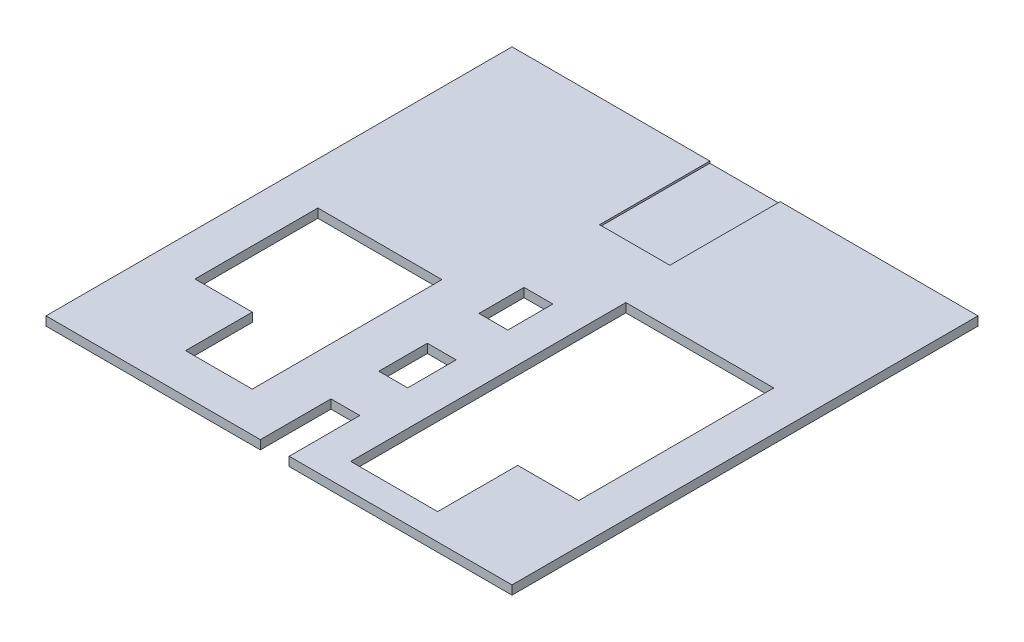
ISO-10303-21;
HEADER;
FILE_DESCRIPTION(('STEP AP214'),'2;1');
FILE_NAME('part.step','',(''),(''),'','','');
FILE_SCHEMA(('AUTOMOTIVE_DESIGN { 1 0 10303 214 1 1 1 1 }'));
ENDSEC;
DATA;
#1=APPLICATION_CONTEXT('core data for automotive mechanical design processes');
#2=APPLICATION_PROTOCOL_DEFINITION('international standard','automotive_design',2000,#1);
#3=PRODUCT_CONTEXT('',#1,'mechanical');
#4=PRODUCT('Part','Part','',(#3));
#5=PRODUCT_RELATED_PRODUCT_CATEGORY('part','',(#4));
#6=PRODUCT_DEFINITION_FORMATION('','',#4);
#7=PRODUCT_DEFINITION_CONTEXT('part definition',#1,'design');
#8=PRODUCT_DEFINITION('design','',#6,#7);
#9=PRODUCT_DEFINITION_SHAPE('','',#8);
#10=(LENGTH_UNIT() NAMED_UNIT(*) SI_UNIT(.MILLI.,.METRE.));
#11=(NAMED_UNIT(*) PLANE_ANGLE_UNIT() SI_UNIT($,.RADIAN.));
#12=(NAMED_UNIT(*) SI_UNIT($,.STERADIAN.) SOLID_ANGLE_UNIT());
#13=UNCERTAINTY_MEASURE_WITH_UNIT(LENGTH_MEASURE(1.E-05),#10,'distance_accuracy_value','');
#14=(GEOMETRIC_REPRESENTATION_CONTEXT(3) GLOBAL_UNCERTAINTY_ASSIGNED_CONTEXT((#13)) GLOBAL_UNIT_ASSIGNED_CONTEXT((#10,
#11,#12)) REPRESENTATION_CONTEXT('',''));
#15=CARTESIAN_POINT('',(0.,0.,0.));
#16=DIRECTION('',(0.,0.,1.));
#17=DIRECTION('',(1.,0.,0.));
#18=AXIS2_PLACEMENT_3D('',#15,#16,#17);
#19=CARTESIAN_POINT('',(0.,2.3,0.));
#20=DIRECTION('',(0.,-1.,0.));
#21=DIRECTION('',(0.,0.,-1.));
#22=AXIS2_PLACEMENT_3D('',#19,#20,#21);
#23=PLANE('',#22);
#24=DIRECTION('',(0.,0.,-1.));
#25=VECTOR('',#24,1.);
#26=CARTESIAN_POINT('',(25.7198970679973,2.3,0.));
#27=LINE('',#26,#25);
#28=CARTESIAN_POINT('',(25.7198970679973,2.3,-10.2105821290763));
#29=VERTEX_POINT('',#28);
#30=CARTESIAN_POINT('',(25.7198970679973,2.3,-27.3967942055364));
#31=VERTEX_POINT('',#30);
#32=EDGE_CURVE('E414',#29,#31,#27,.T.);
#33=ORIENTED_EDGE('',*,*,#32,.T.);
#34=DIRECTION('',(1.,0.,0.));
#35=VECTOR('',#34,1.);
#36=CARTESIAN_POINT('',(0.,2.3,-27.3967942055364));
#37=LINE('',#36,#35);
#38=CARTESIAN_POINT('',(10.9506312686845,2.3,-27.3967942055364));
#39=VERTEX_POINT('',#38);
#40=EDGE_CURVE('E429',#39,#31,#37,.T.);
#41=ORIENTED_EDGE('',*,*,#40,.F.);
#42=DIRECTION('',(0.,0.,1.));
#43=VECTOR('',#42,1.);
#44=CARTESIAN_POINT('',(10.9506312686845,2.3,0.));
#45=LINE('',#44,#43);
#46=CARTESIAN_POINT('',(10.9506312686845,2.3,-59.0583566195129));
#47=VERTEX_POINT('',#46);
#48=EDGE_CURVE('E426',#47,#39,#45,.T.);
#49=ORIENTED_EDGE('',*,*,#48,.F.);
#50=DIRECTION('',(1.,0.,0.));
#51=VECTOR('',#50,1.);
#52=CARTESIAN_POINT('',(0.,2.3,-59.0583566195129));
#53=LINE('',#52,#51);
#54=CARTESIAN_POINT('',(42.8973244163302,2.3,-59.0583566195129));
#55=VERTEX_POINT('',#54);
#56=EDGE_CURVE('E423',#47,#55,#53,.T.);
#57=ORIENTED_EDGE('',*,*,#56,.T.);
#58=DIRECTION('',(0.,0.,1.));
#59=VECTOR('',#58,1.);
#60=CARTESIAN_POINT('',(42.8973244163302,2.3,0.));
#61=LINE('',#60,#59);
#62=CARTESIAN_POINT('',(42.8973244163302,2.3,-10.2105821290763));
#63=VERTEX_POINT('',#62);
#64=EDGE_CURVE('E420',#55,#63,#61,.T.);
#65=ORIENTED_EDGE('',*,*,#64,.T.);
#66=DIRECTION('',(1.,0.,0.));
#67=VECTOR('',#66,1.);
#68=CARTESIAN_POINT('',(0.,2.3,-10.2105821290763));
#69=LINE('',#68,#67);
#70=EDGE_CURVE('E417',#29,#63,#69,.T.);
#71=ORIENTED_EDGE('',*,*,#70,.F.);
#72=EDGE_LOOP('',(#33,#41,#49,#57,#65,#71));
#73=FACE_BOUND('',#72,.T.);
#74=DIRECTION('',(0.,0.,-1.));
#75=VECTOR('',#74,1.);
#76=CARTESIAN_POINT('',(62.6240548528614,2.3,0.));
#77=LINE('',#76,#75);
#78=CARTESIAN_POINT('',(62.6240548528614,2.3,-30.4982257973734));
#79=VERTEX_POINT('',#78);
#80=CARTESIAN_POINT('',(62.6240548528614,2.3,-42.9965652808733));
#81=VERTEX_POINT('',#80);
#82=EDGE_CURVE('E355',#79,#81,#77,.T.);
#83=ORIENTED_EDGE('',*,*,#82,.F.);
#84=DIRECTION('',(1.,0.,0.));
#85=VECTOR('',#84,1.);
#86=CARTESIAN_POINT('',(0.,2.3,-30.4982257973734));
#87=LINE('',#86,#85);
#88=CARTESIAN_POINT('',(55.2019322189707,2.3,-30.4982257973734));
#89=VERTEX_POINT('',#88);
#90=EDGE_CURVE('E353',#89,#79,#87,.T.);
#91=ORIENTED_EDGE('',*,*,#90,.F.);
#92=DIRECTION('',(0.,0.,-1.));
#93=VECTOR('',#92,1.);
#94=CARTESIAN_POINT('',(55.2019322189707,2.3,0.));
#95=LINE('',#94,#93);
#96=CARTESIAN_POINT('',(55.2019322189707,2.3,-42.9965652808733));
#97=VERTEX_POINT('',#96);
#98=EDGE_CURVE('E361',#89,#97,#95,.T.);
#99=ORIENTED_EDGE('',*,*,#98,.T.);
#100=DIRECTION('',(1.,0.,0.));
#101=VECTOR('',#100,1.);
#102=CARTESIAN_POINT('',(0.,2.3,-42.9965652808733));
#103=LINE('',#102,#101);
#104=EDGE_CURVE('E358',#97,#81,#103,.T.);
#105=ORIENTED_EDGE('',*,*,#104,.T.);
#106=EDGE_LOOP('',(#83,#91,#99,#105));
#107=FACE_BOUND('',#106,.T.);
#108=DIRECTION('',(0.,0.,-1.));
#109=VECTOR('',#108,1.);
#110=CARTESIAN_POINT('',(62.6240548528614,2.3,0.));
#111=LINE('',#110,#109);
#112=CARTESIAN_POINT('',(62.6240548528614,2.3,-56.2836492833299));
#113=VERTEX_POINT('',#112);
#114=CARTESIAN_POINT('',(62.6240548528614,2.3,-67.8974479540102));
#115=VERTEX_POINT('',#114);
#116=EDGE_CURVE('E324',#113,#115,#111,.T.);
#117=ORIENTED_EDGE('',*,*,#116,.F.);
#118=DIRECTION('',(1.,0.,0.));
#119=VECTOR('',#118,1.);
#120=CARTESIAN_POINT('',(0.,2.3,-56.2836492833299));
#121=LINE('',#120,#119);
#122=CARTESIAN_POINT('',(55.2019322189707,2.3,-56.2836492833299));
#123=VERTEX_POINT('',#122);
#124=EDGE_CURVE('E322',#123,#113,#121,.T.);
#125=ORIENTED_EDGE('',*,*,#124,.F.);
#126=DIRECTION('',(0.,0.,-1.));
#127=VECTOR('',#126,1.);
#128=CARTESIAN_POINT('',(55.2019322189707,2.3,0.));
#129=LINE('',#128,#127);
#130=CARTESIAN_POINT('',(55.2019322189707,2.3,-67.8974479540102));
#131=VERTEX_POINT('',#130);
#132=EDGE_CURVE('E330',#123,#131,#129,.T.);
#133=ORIENTED_EDGE('',*,*,#132,.T.);
#134=DIRECTION('',(1.,0.,0.));
#135=VECTOR('',#134,1.);
#136=CARTESIAN_POINT('',(0.,2.3,-67.8974479540102));
#137=LINE('',#136,#135);
#138=EDGE_CURVE('E327',#131,#115,#137,.T.);
#139=ORIENTED_EDGE('',*,*,#138,.T.);
#140=EDGE_LOOP('',(#117,#125,#133,#139));
#141=FACE_BOUND('',#140,.T.);
#142=DIRECTION('',(0.,0.,-1.));
#143=VECTOR('',#142,1.);
#144=CARTESIAN_POINT('',(94.0804200967342,2.3,0.));
#145=LINE('',#144,#143);
#146=CARTESIAN_POINT('',(94.0804200967342,2.3,-6.77035313916363));
#147=VERTEX_POINT('',#146);
#148=CARTESIAN_POINT('',(94.0804200967342,2.3,-27.3967942055364));
#149=VERTEX_POINT('',#148);
#150=EDGE_CURVE('E284',#147,#149,#145,.T.);
#151=ORIENTED_EDGE('',*,*,#150,.F.);
#152=DIRECTION('',(1.,0.,0.));
#153=VECTOR('',#152,1.);
#154=CARTESIAN_POINT('',(0.,2.3,-6.77035313916363));
#155=LINE('',#154,#153);
#156=CARTESIAN_POINT('',(71.6957255308728,2.3,-6.77035313916363));
#157=VERTEX_POINT('',#156);
#158=EDGE_CURVE('E56',#157,#147,#155,.T.);
#159=ORIENTED_EDGE('',*,*,#158,.F.);
#160=DIRECTION('',(0.,0.,1.));
#161=VECTOR('',#160,1.);
#162=CARTESIAN_POINT('',(71.6957255308728,2.3,0.));
#163=LINE('',#162,#161);
#164=CARTESIAN_POINT('',(71.6957255308728,2.3,-77.620899486103));
#165=VERTEX_POINT('',#164);
#166=EDGE_CURVE('E296',#165,#157,#163,.T.);
#167=ORIENTED_EDGE('',*,*,#166,.F.);
#168=DIRECTION('',(1.,0.,0.));
#169=VECTOR('',#168,1.);
#170=CARTESIAN_POINT('',(0.,2.3,-77.620899486103));
#171=LINE('',#170,#169);
#172=CARTESIAN_POINT('',(109.790535643032,2.3,-77.620899486103));
#173=VERTEX_POINT('',#172);
#174=EDGE_CURVE('E293',#165,#173,#171,.T.);
#175=ORIENTED_EDGE('',*,*,#174,.T.);
#176=DIRECTION('',(0.,0.,1.));
#177=VECTOR('',#176,1.);
#178=CARTESIAN_POINT('',(109.790535643032,2.3,0.));
#179=LINE('',#178,#177);
#180=CARTESIAN_POINT('',(109.790535643032,2.3,-27.3967942055364));
#181=VERTEX_POINT('',#180);
#182=EDGE_CURVE('E290',#173,#181,#179,.T.);
#183=ORIENTED_EDGE('',*,*,#182,.T.);
#184=DIRECTION('',(-1.,0.,0.));
#185=VECTOR('',#184,1.);
#186=CARTESIAN_POINT('',(0.,2.3,-27.3967942055364));
#187=LINE('',#186,#185);
#188=EDGE_CURVE('E287',#181,#149,#187,.T.);
#189=ORIENTED_EDGE('',*,*,#188,.T.);
#190=EDGE_LOOP('',(#151,#159,#167,#175,#183,#189));
#191=FACE_BOUND('',#190,.T.);
#192=DIRECTION('',(0.,0.,1.));
#193=VECTOR('',#192,1.);
#194=CARTESIAN_POINT('',(69.05,2.3,0.));
#195=LINE('',#194,#193);
#196=CARTESIAN_POINT('',(69.05,2.3,-120.));
#197=VERTEX_POINT('',#196);
#198=CARTESIAN_POINT('',(69.05,2.3,-91.6));
#199=VERTEX_POINT('',#198);
#200=EDGE_CURVE('E501',#197,#199,#195,.T.);
#201=ORIENTED_EDGE('',*,*,#200,.T.);
#202=DIRECTION('',(1.,0.,0.));
#203=VECTOR('',#202,1.);
#204=CARTESIAN_POINT('',(0.,2.3,-91.6));
#205=LINE('',#204,#203);
#206=CARTESIAN_POINT('',(50.95,2.3,-91.6));
#207=VERTEX_POINT('',#206);
#208=EDGE_CURVE('E500',#207,#199,#205,.T.);
#209=ORIENTED_EDGE('',*,*,#208,.F.);
#210=DIRECTION('',(0.,0.,1.));
#211=VECTOR('',#210,1.);
#212=CARTESIAN_POINT('',(50.95,2.3,0.));
#213=LINE('',#212,#211);
#214=CARTESIAN_POINT('',(50.95,2.3,-120.));
#215=VERTEX_POINT('',#214);
#216=EDGE_CURVE('E498',#215,#207,#213,.T.);
#217=ORIENTED_EDGE('',*,*,#216,.F.);
#218=DIRECTION('',(-1.,0.,0.));
#219=VECTOR('',#218,1.);
#220=CARTESIAN_POINT('',(0.,2.3,-120.));
#221=LINE('',#220,#219);
#222=CARTESIAN_POINT('',(0.,2.3,-120.));
#223=VERTEX_POINT('',#222);
#224=EDGE_CURVE('E262',#215,#223,#221,.T.);
#225=ORIENTED_EDGE('',*,*,#224,.T.);
#226=DIRECTION('',(0.,0.,1.));
#227=VECTOR('',#226,1.);
#228=CARTESIAN_POINT('',(0.,2.3,0.));
#229=LINE('',#228,#227);
#230=CARTESIAN_POINT('',(0.,2.3,0.));
#231=VERTEX_POINT('',#230);
#232=EDGE_CURVE('E449',#223,#231,#229,.T.);
#233=ORIENTED_EDGE('',*,*,#232,.T.);
#234=DIRECTION('',(1.,0.,0.));
#235=VECTOR('',#234,1.);
#236=CARTESIAN_POINT('',(0.,2.3,0.));
#237=LINE('',#236,#235);
#238=CARTESIAN_POINT('',(55.2019322189707,2.3,0.));
#239=VERTEX_POINT('',#238);
#240=EDGE_CURVE('E454',#231,#239,#237,.T.);
#241=ORIENTED_EDGE('',*,*,#240,.T.);
#242=DIRECTION('',(0.,0.,-1.));
#243=VECTOR('',#242,1.);
#244=CARTESIAN_POINT('',(55.2019322189707,2.3,0.));
#245=LINE('',#244,#243);
#246=CARTESIAN_POINT('',(55.2019322189707,2.3,-18.1779615413404));
#247=VERTEX_POINT('',#246);
#248=EDGE_CURVE('E386',#239,#247,#245,.T.);
#249=ORIENTED_EDGE('',*,*,#248,.T.);
#250=DIRECTION('',(1.,0.,0.));
#251=VECTOR('',#250,1.);
#252=CARTESIAN_POINT('',(0.,2.3,-18.1779615413404));
#253=LINE('',#252,#251);
#254=CARTESIAN_POINT('',(62.6240548528614,2.3,-18.1779615413404));
#255=VERTEX_POINT('',#254);
#256=EDGE_CURVE('E383',#247,#255,#253,.T.);
#257=ORIENTED_EDGE('',*,*,#256,.T.);
#258=DIRECTION('',(0.,0.,-1.));
#259=VECTOR('',#258,1.);
#260=CARTESIAN_POINT('',(62.6240548528614,2.3,0.));
#261=LINE('',#260,#259);
#262=CARTESIAN_POINT('',(62.6240548528614,2.3,0.));
#263=VERTEX_POINT('',#262);
#264=EDGE_CURVE('E380',#263,#255,#261,.T.);
#265=ORIENTED_EDGE('',*,*,#264,.F.);
#266=CARTESIAN_POINT('',(120.,2.3,0.));
#267=VERTEX_POINT('',#266);
#268=EDGE_CURVE('E452',#263,#267,#237,.T.);
#269=ORIENTED_EDGE('',*,*,#268,.T.);
#270=DIRECTION('',(0.,0.,-1.));
#271=VECTOR('',#270,1.);
#272=CARTESIAN_POINT('',(120.,2.3,0.));
#273=LINE('',#272,#271);
#274=CARTESIAN_POINT('',(120.,2.3,-120.));
#275=VERTEX_POINT('',#274);
#276=EDGE_CURVE('E457',#267,#275,#273,.T.);
#277=ORIENTED_EDGE('',*,*,#276,.T.);
#278=EDGE_CURVE('E459',#275,#197,#221,.T.);
#279=ORIENTED_EDGE('',*,*,#278,.T.);
#280=EDGE_LOOP('',(#201,#209,#217,#225,#233,#241,#249,#257,#265,#269,#277,#279));
#281=FACE_BOUND('',#280,.T.);
#282=ADVANCED_FACE('F33',(#73,#107,#141,#191,#281),#23,.F.);
#283=CARTESIAN_POINT('',(0.,2.3,-120.));
#284=DIRECTION('',(0.,0.,1.));
#285=DIRECTION('',(1.,0.,0.));
#286=AXIS2_PLACEMENT_3D('',#283,#284,#285);
#287=PLANE('',#286);
#288=DIRECTION('',(0.,1.,0.));
#289=VECTOR('',#288,1.);
#290=CARTESIAN_POINT('',(69.05,1.8,-120.));
#291=LINE('',#290,#289);
#292=CARTESIAN_POINT('',(69.05,1.8,-120.));
#293=VERTEX_POINT('',#292);
#294=EDGE_CURVE('E263',#293,#197,#291,.T.);
#295=ORIENTED_EDGE('',*,*,#294,.T.);
#296=ORIENTED_EDGE('',*,*,#278,.F.);
#297=DIRECTION('',(0.,-1.,0.));
#298=VECTOR('',#297,1.);
#299=CARTESIAN_POINT('',(120.,2.3,-120.));
#300=LINE('',#299,#298);
#301=CARTESIAN_POINT('',(120.,0.,-120.));
#302=VERTEX_POINT('',#301);
#303=EDGE_CURVE('E474',#275,#302,#300,.T.);
#304=ORIENTED_EDGE('',*,*,#303,.T.);
#305=DIRECTION('',(-1.,0.,0.));
#306=VECTOR('',#305,1.);
#307=CARTESIAN_POINT('',(0.,0.,-120.));
#308=LINE('',#307,#306);
#309=CARTESIAN_POINT('',(0.,0.,-120.));
#310=VERTEX_POINT('',#309);
#311=EDGE_CURVE('E453',#302,#310,#308,.T.);
#312=ORIENTED_EDGE('',*,*,#311,.T.);
#313=DIRECTION('',(0.,-1.,0.));
#314=VECTOR('',#313,1.);
#315=CARTESIAN_POINT('',(0.,2.3,-120.));
#316=LINE('',#315,#314);
#317=EDGE_CURVE('E462',#223,#310,#316,.T.);
#318=ORIENTED_EDGE('',*,*,#317,.F.);
#319=ORIENTED_EDGE('',*,*,#224,.F.);
#320=DIRECTION('',(0.,1.,0.));
#321=VECTOR('',#320,1.);
#322=CARTESIAN_POINT('',(50.95,1.8,-120.));
#323=LINE('',#322,#321);
#324=CARTESIAN_POINT('',(50.95,1.8,-120.));
#325=VERTEX_POINT('',#324);
#326=EDGE_CURVE('E247',#325,#215,#323,.T.);
#327=ORIENTED_EDGE('',*,*,#326,.F.);
#328=DIRECTION('',(-1.,0.,0.));
#329=VECTOR('',#328,1.);
#330=CARTESIAN_POINT('',(0.,1.8,-120.));
#331=LINE('',#330,#329);
#332=EDGE_CURVE('E252',#293,#325,#331,.T.);
#333=ORIENTED_EDGE('',*,*,#332,.F.);
#334=EDGE_LOOP('',(#295,#296,#304,#312,#318,#319,#327,#333));
#335=FACE_BOUND('',#334,.T.);
#336=ADVANCED_FACE('F260',(#335),#287,.F.);
#337=CARTESIAN_POINT('',(0.,0.,0.));
#338=DIRECTION('',(0.,-1.,0.));
#339=DIRECTION('',(0.,0.,-1.));
#340=AXIS2_PLACEMENT_3D('',#337,#338,#339);
#341=PLANE('',#340);
#342=DIRECTION('',(1.,0.,0.));
#343=VECTOR('',#342,1.);
#344=CARTESIAN_POINT('',(0.,0.,-6.77035313916363));
#345=LINE('',#344,#343);
#346=CARTESIAN_POINT('',(71.6957255308728,0.,-6.77035313916363));
#347=VERTEX_POINT('',#346);
#348=CARTESIAN_POINT('',(94.0804200967342,0.,-6.77035313916363));
#349=VERTEX_POINT('',#348);
#350=EDGE_CURVE('E280',#347,#349,#345,.T.);
#351=ORIENTED_EDGE('',*,*,#350,.T.);
#352=DIRECTION('',(0.,0.,-1.));
#353=VECTOR('',#352,1.);
#354=CARTESIAN_POINT('',(94.0804200967342,0.,0.));
#355=LINE('',#354,#353);
#356=CARTESIAN_POINT('',(94.0804200967342,0.,-27.3967942055364));
#357=VERTEX_POINT('',#356);
#358=EDGE_CURVE('E302',#349,#357,#355,.T.);
#359=ORIENTED_EDGE('',*,*,#358,.T.);
#360=DIRECTION('',(-1.,0.,0.));
#361=VECTOR('',#360,1.);
#362=CARTESIAN_POINT('',(0.,0.,-27.3967942055364));
#363=LINE('',#362,#361);
#364=CARTESIAN_POINT('',(109.790535643032,0.,-27.3967942055364));
#365=VERTEX_POINT('',#364);
#366=EDGE_CURVE('E270',#365,#357,#363,.T.);
#367=ORIENTED_EDGE('',*,*,#366,.F.);
#368=DIRECTION('',(0.,0.,1.));
#369=VECTOR('',#368,1.);
#370=CARTESIAN_POINT('',(109.790535643032,0.,0.));
#371=LINE('',#370,#369);
#372=CARTESIAN_POINT('',(109.790535643032,0.,-77.620899486103));
#373=VERTEX_POINT('',#372);
#374=EDGE_CURVE('E273',#373,#365,#371,.T.);
#375=ORIENTED_EDGE('',*,*,#374,.F.);
#376=DIRECTION('',(1.,0.,0.));
#377=VECTOR('',#376,1.);
#378=CARTESIAN_POINT('',(0.,0.,-77.620899486103));
#379=LINE('',#378,#377);
#380=CARTESIAN_POINT('',(71.6957255308728,0.,-77.620899486103));
#381=VERTEX_POINT('',#380);
#382=EDGE_CURVE('E275',#381,#373,#379,.T.);
#383=ORIENTED_EDGE('',*,*,#382,.F.);
#384=DIRECTION('',(0.,0.,1.));
#385=VECTOR('',#384,1.);
#386=CARTESIAN_POINT('',(71.6957255308728,0.,0.));
#387=LINE('',#386,#385);
#388=EDGE_CURVE('E277',#381,#347,#387,.T.);
#389=ORIENTED_EDGE('',*,*,#388,.T.);
#390=EDGE_LOOP('',(#351,#359,#367,#375,#383,#389));
#391=FACE_BOUND('',#390,.T.);
#392=DIRECTION('',(1.,0.,0.));
#393=VECTOR('',#392,1.);
#394=CARTESIAN_POINT('',(0.,0.,-56.2836492833299));
#395=LINE('',#394,#393);
#396=CARTESIAN_POINT('',(55.2019322189707,0.,-56.2836492833299));
#397=VERTEX_POINT('',#396);
#398=CARTESIAN_POINT('',(62.6240548528614,0.,-56.2836492833299));
#399=VERTEX_POINT('',#398);
#400=EDGE_CURVE('E319',#397,#399,#395,.T.);
#401=ORIENTED_EDGE('',*,*,#400,.T.);
#402=DIRECTION('',(0.,0.,-1.));
#403=VECTOR('',#402,1.);
#404=CARTESIAN_POINT('',(62.6240548528614,0.,0.));
#405=LINE('',#404,#403);
#406=CARTESIAN_POINT('',(62.6240548528614,0.,-67.8974479540102));
#407=VERTEX_POINT('',#406);
#408=EDGE_CURVE('E336',#399,#407,#405,.T.);
#409=ORIENTED_EDGE('',*,*,#408,.T.);
#410=DIRECTION('',(1.,0.,0.));
#411=VECTOR('',#410,1.);
#412=CARTESIAN_POINT('',(0.,0.,-67.8974479540102));
#413=LINE('',#412,#411);
#414=CARTESIAN_POINT('',(55.2019322189707,0.,-67.8974479540102));
#415=VERTEX_POINT('',#414);
#416=EDGE_CURVE('E314',#415,#407,#413,.T.);
#417=ORIENTED_EDGE('',*,*,#416,.F.);
#418=DIRECTION('',(0.,0.,-1.));
#419=VECTOR('',#418,1.);
#420=CARTESIAN_POINT('',(55.2019322189707,0.,0.));
#421=LINE('',#420,#419);
#422=EDGE_CURVE('E317',#397,#415,#421,.T.);
#423=ORIENTED_EDGE('',*,*,#422,.F.);
#424=EDGE_LOOP('',(#401,#409,#417,#423));
#425=FACE_BOUND('',#424,.T.);
#426=DIRECTION('',(1.,0.,0.));
#427=VECTOR('',#426,1.);
#428=CARTESIAN_POINT('',(0.,0.,-30.4982257973734));
#429=LINE('',#428,#427);
#430=CARTESIAN_POINT('',(55.2019322189707,0.,-30.4982257973734));
#431=VERTEX_POINT('',#430);
#432=CARTESIAN_POINT('',(62.6240548528614,0.,-30.4982257973734));
#433=VERTEX_POINT('',#432);
#434=EDGE_CURVE('E350',#431,#433,#429,.T.);
#435=ORIENTED_EDGE('',*,*,#434,.T.);
#436=DIRECTION('',(0.,0.,-1.));
#437=VECTOR('',#436,1.);
#438=CARTESIAN_POINT('',(62.6240548528614,0.,0.));
#439=LINE('',#438,#437);
#440=CARTESIAN_POINT('',(62.6240548528614,0.,-42.9965652808733));
#441=VERTEX_POINT('',#440);
#442=EDGE_CURVE('E367',#433,#441,#439,.T.);
#443=ORIENTED_EDGE('',*,*,#442,.T.);
#444=DIRECTION('',(1.,0.,0.));
#445=VECTOR('',#444,1.);
#446=CARTESIAN_POINT('',(0.,0.,-42.9965652808733));
#447=LINE('',#446,#445);
#448=CARTESIAN_POINT('',(55.2019322189707,0.,-42.9965652808733));
#449=VERTEX_POINT('',#448);
#450=EDGE_CURVE('E345',#449,#441,#447,.T.);
#451=ORIENTED_EDGE('',*,*,#450,.F.);
#452=DIRECTION('',(0.,0.,-1.));
#453=VECTOR('',#452,1.);
#454=CARTESIAN_POINT('',(55.2019322189707,0.,0.));
#455=LINE('',#454,#453);
#456=EDGE_CURVE('E348',#431,#449,#455,.T.);
#457=ORIENTED_EDGE('',*,*,#456,.F.);
#458=EDGE_LOOP('',(#435,#443,#451,#457));
#459=FACE_BOUND('',#458,.T.);
#460=DIRECTION('',(1.,0.,0.));
#461=VECTOR('',#460,1.);
#462=CARTESIAN_POINT('',(0.,0.,-27.3967942055364));
#463=LINE('',#462,#461);
#464=CARTESIAN_POINT('',(10.9506312686845,0.,-27.3967942055364));
#465=VERTEX_POINT('',#464);
#466=CARTESIAN_POINT('',(25.7198970679973,0.,-27.3967942055364));
#467=VERTEX_POINT('',#466);
#468=EDGE_CURVE('E409',#465,#467,#463,.T.);
#469=ORIENTED_EDGE('',*,*,#468,.T.);
#470=DIRECTION('',(0.,0.,-1.));
#471=VECTOR('',#470,1.);
#472=CARTESIAN_POINT('',(25.7198970679973,0.,0.));
#473=LINE('',#472,#471);
#474=CARTESIAN_POINT('',(25.7198970679973,0.,-10.2105821290763));
#475=VERTEX_POINT('',#474);
#476=EDGE_CURVE('E412',#475,#467,#473,.T.);
#477=ORIENTED_EDGE('',*,*,#476,.F.);
#478=DIRECTION('',(1.,0.,0.));
#479=VECTOR('',#478,1.);
#480=CARTESIAN_POINT('',(0.,0.,-10.2105821290763));
#481=LINE('',#480,#479);
#482=CARTESIAN_POINT('',(42.8973244163302,0.,-10.2105821290763));
#483=VERTEX_POINT('',#482);
#484=EDGE_CURVE('E435',#475,#483,#481,.T.);
#485=ORIENTED_EDGE('',*,*,#484,.T.);
#486=DIRECTION('',(0.,0.,1.));
#487=VECTOR('',#486,1.);
#488=CARTESIAN_POINT('',(42.8973244163302,0.,0.));
#489=LINE('',#488,#487);
#490=CARTESIAN_POINT('',(42.8973244163302,0.,-59.0583566195129));
#491=VERTEX_POINT('',#490);
#492=EDGE_CURVE('E401',#491,#483,#489,.T.);
#493=ORIENTED_EDGE('',*,*,#492,.F.);
#494=DIRECTION('',(1.,0.,0.));
#495=VECTOR('',#494,1.);
#496=CARTESIAN_POINT('',(0.,0.,-59.0583566195129));
#497=LINE('',#496,#495);
#498=CARTESIAN_POINT('',(10.9506312686845,0.,-59.0583566195129));
#499=VERTEX_POINT('',#498);
#500=EDGE_CURVE('E404',#499,#491,#497,.T.);
#501=ORIENTED_EDGE('',*,*,#500,.F.);
#502=DIRECTION('',(0.,0.,1.));
#503=VECTOR('',#502,1.);
#504=CARTESIAN_POINT('',(10.9506312686845,0.,0.));
#505=LINE('',#504,#503);
#506=EDGE_CURVE('E406',#499,#465,#505,.T.);
#507=ORIENTED_EDGE('',*,*,#506,.T.);
#508=EDGE_LOOP('',(#469,#477,#485,#493,#501,#507));
#509=FACE_BOUND('',#508,.T.);
#510=DIRECTION('',(1.,0.,0.));
#511=VECTOR('',#510,1.);
#512=CARTESIAN_POINT('',(0.,0.,-18.1779615413404));
#513=LINE('',#512,#511);
#514=CARTESIAN_POINT('',(55.2019322189707,0.,-18.1779615413404));
#515=VERTEX_POINT('',#514);
#516=CARTESIAN_POINT('',(62.6240548528614,0.,-18.1779615413404));
#517=VERTEX_POINT('',#516);
#518=EDGE_CURVE('E376',#515,#517,#513,.T.);
#519=ORIENTED_EDGE('',*,*,#518,.F.);
#520=DIRECTION('',(0.,0.,-1.));
#521=VECTOR('',#520,1.);
#522=CARTESIAN_POINT('',(55.2019322189707,0.,0.));
#523=LINE('',#522,#521);
#524=CARTESIAN_POINT('',(55.2019322189707,0.,0.));
#525=VERTEX_POINT('',#524);
#526=EDGE_CURVE('E378',#525,#515,#523,.T.);
#527=ORIENTED_EDGE('',*,*,#526,.F.);
#528=DIRECTION('',(1.,0.,0.));
#529=VECTOR('',#528,1.);
#530=CARTESIAN_POINT('',(0.,0.,0.));
#531=LINE('',#530,#529);
#532=CARTESIAN_POINT('',(0.,0.,0.));
#533=VERTEX_POINT('',#532);
#534=EDGE_CURVE('E466',#533,#525,#531,.T.);
#535=ORIENTED_EDGE('',*,*,#534,.F.);
#536=DIRECTION('',(0.,0.,1.));
#537=VECTOR('',#536,1.);
#538=CARTESIAN_POINT('',(0.,0.,0.));
#539=LINE('',#538,#537);
#540=EDGE_CURVE('E448',#310,#533,#539,.T.);
#541=ORIENTED_EDGE('',*,*,#540,.F.);
#542=ORIENTED_EDGE('',*,*,#311,.F.);
#543=DIRECTION('',(0.,0.,-1.));
#544=VECTOR('',#543,1.);
#545=CARTESIAN_POINT('',(120.,0.,0.));
#546=LINE('',#545,#544);
#547=CARTESIAN_POINT('',(120.,0.,0.));
#548=VERTEX_POINT('',#547);
#549=EDGE_CURVE('E469',#548,#302,#546,.T.);
#550=ORIENTED_EDGE('',*,*,#549,.F.);
#551=CARTESIAN_POINT('',(62.6240548528614,0.,0.));
#552=VERTEX_POINT('',#551);
#553=EDGE_CURVE('E465',#552,#548,#531,.T.);
#554=ORIENTED_EDGE('',*,*,#553,.F.);
#555=DIRECTION('',(0.,0.,-1.));
#556=VECTOR('',#555,1.);
#557=CARTESIAN_POINT('',(62.6240548528614,0.,0.));
#558=LINE('',#557,#556);
#559=EDGE_CURVE('E393',#552,#517,#558,.T.);
#560=ORIENTED_EDGE('',*,*,#559,.T.);
#561=EDGE_LOOP('',(#519,#527,#535,#541,#542,#550,#554,#560));
#562=FACE_BOUND('',#561,.T.);
#563=ADVANCED_FACE('F489',(#391,#425,#459,#509,#562),#341,.T.);
#564=CARTESIAN_POINT('',(0.,2.3,0.));
#565=DIRECTION('',(0.,0.,-1.));
#566=DIRECTION('',(-1.,0.,0.));
#567=AXIS2_PLACEMENT_3D('',#564,#565,#566);
#568=PLANE('',#567);
#569=DIRECTION('',(0.,1.,0.));
#570=VECTOR('',#569,1.);
#571=CARTESIAN_POINT('',(55.2019322189707,-0.00100000000000013,0.));
#572=LINE('',#571,#570);
#573=EDGE_CURVE('E390',#525,#239,#572,.T.);
#574=ORIENTED_EDGE('',*,*,#573,.T.);
#575=ORIENTED_EDGE('',*,*,#240,.F.);
#576=DIRECTION('',(0.,-1.,0.));
#577=VECTOR('',#576,1.);
#578=CARTESIAN_POINT('',(0.,2.3,0.));
#579=LINE('',#578,#577);
#580=EDGE_CURVE('E11',#231,#533,#579,.T.);
#581=ORIENTED_EDGE('',*,*,#580,.T.);
#582=ORIENTED_EDGE('',*,*,#534,.T.);
#583=EDGE_LOOP('',(#574,#575,#581,#582));
#584=FACE_BOUND('',#583,.T.);
#585=ADVANCED_FACE('F525',(#584),#568,.F.);
#586=CARTESIAN_POINT('',(0.,2.3,0.));
#587=DIRECTION('',(1.,0.,0.));
#588=DIRECTION('',(0.,0.,-1.));
#589=AXIS2_PLACEMENT_3D('',#586,#587,#588);
#590=PLANE('',#589);
#591=ORIENTED_EDGE('',*,*,#540,.T.);
#592=ORIENTED_EDGE('',*,*,#580,.F.);
#593=ORIENTED_EDGE('',*,*,#232,.F.);
#594=ORIENTED_EDGE('',*,*,#317,.T.);
#595=EDGE_LOOP('',(#591,#592,#593,#594));
#596=FACE_BOUND('',#595,.T.);
#597=ADVANCED_FACE('F35',(#596),#590,.F.);
#598=ORIENTED_EDGE('',*,*,#268,.F.);
#599=DIRECTION('',(0.,1.,0.));
#600=VECTOR('',#599,1.);
#601=CARTESIAN_POINT('',(62.6240548528614,-0.00100000000000013,0.));
#602=LINE('',#601,#600);
#603=EDGE_CURVE('E389',#552,#263,#602,.T.);
#604=ORIENTED_EDGE('',*,*,#603,.F.);
#605=ORIENTED_EDGE('',*,*,#553,.T.);
#606=DIRECTION('',(0.,-1.,0.));
#607=VECTOR('',#606,1.);
#608=CARTESIAN_POINT('',(120.,2.3,0.));
#609=LINE('',#608,#607);
#610=EDGE_CURVE('E41',#267,#548,#609,.T.);
#611=ORIENTED_EDGE('',*,*,#610,.F.);
#612=EDGE_LOOP('',(#598,#604,#605,#611));
#613=FACE_BOUND('',#612,.T.);
#614=ADVANCED_FACE('F513',(#613),#568,.F.);
#615=CARTESIAN_POINT('',(120.,2.3,0.));
#616=DIRECTION('',(-1.,0.,0.));
#617=DIRECTION('',(0.,0.,1.));
#618=AXIS2_PLACEMENT_3D('',#615,#616,#617);
#619=PLANE('',#618);
#620=ORIENTED_EDGE('',*,*,#549,.T.);
#621=ORIENTED_EDGE('',*,*,#303,.F.);
#622=ORIENTED_EDGE('',*,*,#276,.F.);
#623=ORIENTED_EDGE('',*,*,#610,.T.);
#624=EDGE_LOOP('',(#620,#621,#622,#623));
#625=FACE_BOUND('',#624,.T.);
#626=ADVANCED_FACE('F481',(#625),#619,.F.);
#627=CARTESIAN_POINT('',(25.7198970679973,-0.00100000000000013,0.));
#628=DIRECTION('',(1.,0.,0.));
#629=DIRECTION('',(0.,0.,-1.));
#630=AXIS2_PLACEMENT_3D('',#627,#628,#629);
#631=PLANE('',#630);
#632=ORIENTED_EDGE('',*,*,#476,.T.);
#633=DIRECTION('',(0.,1.,0.));
#634=VECTOR('',#633,1.);
#635=CARTESIAN_POINT('',(25.7198970679973,-0.00100000000000013,-27.3967942055364));
#636=LINE('',#635,#634);
#637=EDGE_CURVE('E433',#467,#31,#636,.T.);
#638=ORIENTED_EDGE('',*,*,#637,.T.);
#639=ORIENTED_EDGE('',*,*,#32,.F.);
#640=DIRECTION('',(0.,1.,0.));
#641=VECTOR('',#640,1.);
#642=CARTESIAN_POINT('',(25.7198970679973,-0.00100000000000013,-10.2105821290763));
#643=LINE('',#642,#641);
#644=EDGE_CURVE('E432',#475,#29,#643,.T.);
#645=ORIENTED_EDGE('',*,*,#644,.F.);
#646=EDGE_LOOP('',(#632,#638,#639,#645));
#647=FACE_BOUND('',#646,.T.);
#648=ADVANCED_FACE('F544',(#647),#631,.T.);
#649=CARTESIAN_POINT('',(0.,-0.00100000000000013,-27.3967942055364));
#650=DIRECTION('',(0.,0.,1.));
#651=DIRECTION('',(1.,0.,0.));
#652=AXIS2_PLACEMENT_3D('',#649,#650,#651);
#653=PLANE('',#652);
#654=DIRECTION('',(0.,1.,0.));
#655=VECTOR('',#654,1.);
#656=CARTESIAN_POINT('',(10.9506312686845,-0.00100000000000013,-27.3967942055364));
#657=LINE('',#656,#655);
#658=EDGE_CURVE('E436',#465,#39,#657,.T.);
#659=ORIENTED_EDGE('',*,*,#658,.T.);
#660=ORIENTED_EDGE('',*,*,#40,.T.);
#661=ORIENTED_EDGE('',*,*,#637,.F.);
#662=ORIENTED_EDGE('',*,*,#468,.F.);
#663=EDGE_LOOP('',(#659,#660,#661,#662));
#664=FACE_BOUND('',#663,.T.);
#665=ADVANCED_FACE('F550',(#664),#653,.F.);
#666=CARTESIAN_POINT('',(10.9506312686845,-0.00100000000000013,0.));
#667=DIRECTION('',(-1.,0.,0.));
#668=DIRECTION('',(0.,0.,1.));
#669=AXIS2_PLACEMENT_3D('',#666,#667,#668);
#670=PLANE('',#669);
#671=DIRECTION('',(0.,1.,0.));
#672=VECTOR('',#671,1.);
#673=CARTESIAN_POINT('',(10.9506312686845,-0.00100000000000013,-59.0583566195129));
#674=LINE('',#673,#672);
#675=EDGE_CURVE('E438',#499,#47,#674,.T.);
#676=ORIENTED_EDGE('',*,*,#675,.T.);
#677=ORIENTED_EDGE('',*,*,#48,.T.);
#678=ORIENTED_EDGE('',*,*,#658,.F.);
#679=ORIENTED_EDGE('',*,*,#506,.F.);
#680=EDGE_LOOP('',(#676,#677,#678,#679));
#681=FACE_BOUND('',#680,.T.);
#682=ADVANCED_FACE('F555',(#681),#670,.F.);
#683=CARTESIAN_POINT('',(0.,-0.00100000000000013,-59.0583566195129));
#684=DIRECTION('',(0.,0.,1.));
#685=DIRECTION('',(1.,0.,0.));
#686=AXIS2_PLACEMENT_3D('',#683,#684,#685);
#687=PLANE('',#686);
#688=ORIENTED_EDGE('',*,*,#500,.T.);
#689=DIRECTION('',(0.,1.,0.));
#690=VECTOR('',#689,1.);
#691=CARTESIAN_POINT('',(42.8973244163302,-0.00100000000000013,-59.0583566195129));
#692=LINE('',#691,#690);
#693=EDGE_CURVE('E440',#491,#55,#692,.T.);
#694=ORIENTED_EDGE('',*,*,#693,.T.);
#695=ORIENTED_EDGE('',*,*,#56,.F.);
#696=ORIENTED_EDGE('',*,*,#675,.F.);
#697=EDGE_LOOP('',(#688,#694,#695,#696));
#698=FACE_BOUND('',#697,.T.);
#699=ADVANCED_FACE('F570',(#698),#687,.T.);
#700=CARTESIAN_POINT('',(42.8973244163302,-0.00100000000000013,0.));
#701=DIRECTION('',(-1.,0.,0.));
#702=DIRECTION('',(0.,0.,1.));
#703=AXIS2_PLACEMENT_3D('',#700,#701,#702);
#704=PLANE('',#703);
#705=ORIENTED_EDGE('',*,*,#492,.T.);
#706=DIRECTION('',(0.,1.,0.));
#707=VECTOR('',#706,1.);
#708=CARTESIAN_POINT('',(42.8973244163302,-0.00100000000000013,-10.2105821290763));
#709=LINE('',#708,#707);
#710=EDGE_CURVE('E442',#483,#63,#709,.T.);
#711=ORIENTED_EDGE('',*,*,#710,.T.);
#712=ORIENTED_EDGE('',*,*,#64,.F.);
#713=ORIENTED_EDGE('',*,*,#693,.F.);
#714=EDGE_LOOP('',(#705,#711,#712,#713));
#715=FACE_BOUND('',#714,.T.);
#716=ADVANCED_FACE('F578',(#715),#704,.T.);
#717=CARTESIAN_POINT('',(0.,-0.00100000000000013,-10.2105821290763));
#718=DIRECTION('',(0.,0.,1.));
#719=DIRECTION('',(1.,0.,0.));
#720=AXIS2_PLACEMENT_3D('',#717,#718,#719);
#721=PLANE('',#720);
#722=ORIENTED_EDGE('',*,*,#644,.T.);
#723=ORIENTED_EDGE('',*,*,#70,.T.);
#724=ORIENTED_EDGE('',*,*,#710,.F.);
#725=ORIENTED_EDGE('',*,*,#484,.F.);
#726=EDGE_LOOP('',(#722,#723,#724,#725));
#727=FACE_BOUND('',#726,.T.);
#728=ADVANCED_FACE('F576',(#727),#721,.F.);
#729=CARTESIAN_POINT('',(55.2019322189707,-0.00100000000000013,0.));
#730=DIRECTION('',(1.,0.,0.));
#731=DIRECTION('',(0.,0.,-1.));
#732=AXIS2_PLACEMENT_3D('',#729,#730,#731);
#733=PLANE('',#732);
#734=ORIENTED_EDGE('',*,*,#526,.T.);
#735=DIRECTION('',(0.,1.,0.));
#736=VECTOR('',#735,1.);
#737=CARTESIAN_POINT('',(55.2019322189707,-0.00100000000000013,-18.1779615413404));
#738=LINE('',#737,#736);
#739=EDGE_CURVE('E394',#515,#247,#738,.T.);
#740=ORIENTED_EDGE('',*,*,#739,.T.);
#741=ORIENTED_EDGE('',*,*,#248,.F.);
#742=ORIENTED_EDGE('',*,*,#573,.F.);
#743=EDGE_LOOP('',(#734,#740,#741,#742));
#744=FACE_BOUND('',#743,.T.);
#745=ADVANCED_FACE('F523',(#744),#733,.T.);
#746=CARTESIAN_POINT('',(0.,-0.00100000000000013,-18.1779615413404));
#747=DIRECTION('',(0.,0.,1.));
#748=DIRECTION('',(1.,0.,0.));
#749=AXIS2_PLACEMENT_3D('',#746,#747,#748);
#750=PLANE('',#749);
#751=ORIENTED_EDGE('',*,*,#518,.T.);
#752=DIRECTION('',(0.,1.,0.));
#753=VECTOR('',#752,1.);
#754=CARTESIAN_POINT('',(62.6240548528614,-0.00100000000000013,-18.1779615413404));
#755=LINE('',#754,#753);
#756=EDGE_CURVE('E396',#517,#255,#755,.T.);
#757=ORIENTED_EDGE('',*,*,#756,.T.);
#758=ORIENTED_EDGE('',*,*,#256,.F.);
#759=ORIENTED_EDGE('',*,*,#739,.F.);
#760=EDGE_LOOP('',(#751,#757,#758,#759));
#761=FACE_BOUND('',#760,.T.);
#762=ADVANCED_FACE('F520',(#761),#750,.T.);
#763=CARTESIAN_POINT('',(62.6240548528614,-0.00100000000000013,0.));
#764=DIRECTION('',(1.,0.,0.));
#765=DIRECTION('',(0.,0.,-1.));
#766=AXIS2_PLACEMENT_3D('',#763,#764,#765);
#767=PLANE('',#766);
#768=ORIENTED_EDGE('',*,*,#603,.T.);
#769=ORIENTED_EDGE('',*,*,#264,.T.);
#770=ORIENTED_EDGE('',*,*,#756,.F.);
#771=ORIENTED_EDGE('',*,*,#559,.F.);
#772=EDGE_LOOP('',(#768,#769,#770,#771));
#773=FACE_BOUND('',#772,.T.);
#774=ADVANCED_FACE('F515',(#773),#767,.F.);
#775=CARTESIAN_POINT('',(0.,-0.00100000000000013,-30.4982257973734));
#776=DIRECTION('',(0.,0.,1.));
#777=DIRECTION('',(1.,0.,0.));
#778=AXIS2_PLACEMENT_3D('',#775,#776,#777);
#779=PLANE('',#778);
#780=DIRECTION('',(0.,1.,0.));
#781=VECTOR('',#780,1.);
#782=CARTESIAN_POINT('',(55.2019322189707,-0.00100000000000013,-30.4982257973734));
#783=LINE('',#782,#781);
#784=EDGE_CURVE('E365',#431,#89,#783,.T.);
#785=ORIENTED_EDGE('',*,*,#784,.T.);
#786=ORIENTED_EDGE('',*,*,#90,.T.);
#787=DIRECTION('',(0.,1.,0.));
#788=VECTOR('',#787,1.);
#789=CARTESIAN_POINT('',(62.6240548528614,-0.00100000000000013,-30.4982257973734));
#790=LINE('',#789,#788);
#791=EDGE_CURVE('E364',#433,#79,#790,.T.);
#792=ORIENTED_EDGE('',*,*,#791,.F.);
#793=ORIENTED_EDGE('',*,*,#434,.F.);
#794=EDGE_LOOP('',(#785,#786,#792,#793));
#795=FACE_BOUND('',#794,.T.);
#796=ADVANCED_FACE('F591',(#795),#779,.F.);
#797=CARTESIAN_POINT('',(55.2019322189707,-0.00100000000000013,0.));
#798=DIRECTION('',(1.,0.,0.));
#799=DIRECTION('',(0.,0.,-1.));
#800=AXIS2_PLACEMENT_3D('',#797,#798,#799);
#801=PLANE('',#800);
#802=ORIENTED_EDGE('',*,*,#456,.T.);
#803=DIRECTION('',(0.,1.,0.));
#804=VECTOR('',#803,1.);
#805=CARTESIAN_POINT('',(55.2019322189707,-0.00100000000000013,-42.9965652808733));
#806=LINE('',#805,#804);
#807=EDGE_CURVE('E368',#449,#97,#806,.T.);
#808=ORIENTED_EDGE('',*,*,#807,.T.);
#809=ORIENTED_EDGE('',*,*,#98,.F.);
#810=ORIENTED_EDGE('',*,*,#784,.F.);
#811=EDGE_LOOP('',(#802,#808,#809,#810));
#812=FACE_BOUND('',#811,.T.);
#813=ADVANCED_FACE('F598',(#812),#801,.T.);
#814=CARTESIAN_POINT('',(0.,-0.00100000000000013,-42.9965652808733));
#815=DIRECTION('',(0.,0.,1.));
#816=DIRECTION('',(1.,0.,0.));
#817=AXIS2_PLACEMENT_3D('',#814,#815,#816);
#818=PLANE('',#817);
#819=ORIENTED_EDGE('',*,*,#450,.T.);
#820=DIRECTION('',(0.,1.,0.));
#821=VECTOR('',#820,1.);
#822=CARTESIAN_POINT('',(62.6240548528614,-0.00100000000000013,-42.9965652808733));
#823=LINE('',#822,#821);
#824=EDGE_CURVE('E370',#441,#81,#823,.T.);
#825=ORIENTED_EDGE('',*,*,#824,.T.);
#826=ORIENTED_EDGE('',*,*,#104,.F.);
#827=ORIENTED_EDGE('',*,*,#807,.F.);
#828=EDGE_LOOP('',(#819,#825,#826,#827));
#829=FACE_BOUND('',#828,.T.);
#830=ADVANCED_FACE('F604',(#829),#818,.T.);
#831=CARTESIAN_POINT('',(62.6240548528614,-0.00100000000000013,0.));
#832=DIRECTION('',(1.,0.,0.));
#833=DIRECTION('',(0.,0.,-1.));
#834=AXIS2_PLACEMENT_3D('',#831,#832,#833);
#835=PLANE('',#834);
#836=ORIENTED_EDGE('',*,*,#791,.T.);
#837=ORIENTED_EDGE('',*,*,#82,.T.);
#838=ORIENTED_EDGE('',*,*,#824,.F.);
#839=ORIENTED_EDGE('',*,*,#442,.F.);
#840=EDGE_LOOP('',(#836,#837,#838,#839));
#841=FACE_BOUND('',#840,.T.);
#842=ADVANCED_FACE('F600',(#841),#835,.F.);
#843=CARTESIAN_POINT('',(0.,-0.00100000000000013,-56.2836492833299));
#844=DIRECTION('',(0.,0.,1.));
#845=DIRECTION('',(1.,0.,0.));
#846=AXIS2_PLACEMENT_3D('',#843,#844,#845);
#847=PLANE('',#846);
#848=DIRECTION('',(0.,1.,0.));
#849=VECTOR('',#848,1.);
#850=CARTESIAN_POINT('',(55.2019322189707,-0.00100000000000013,-56.2836492833299));
#851=LINE('',#850,#849);
#852=EDGE_CURVE('E334',#397,#123,#851,.T.);
#853=ORIENTED_EDGE('',*,*,#852,.T.);
#854=ORIENTED_EDGE('',*,*,#124,.T.);
#855=DIRECTION('',(0.,1.,0.));
#856=VECTOR('',#855,1.);
#857=CARTESIAN_POINT('',(62.6240548528614,-0.00100000000000013,-56.2836492833299));
#858=LINE('',#857,#856);
#859=EDGE_CURVE('E333',#399,#113,#858,.T.);
#860=ORIENTED_EDGE('',*,*,#859,.F.);
#861=ORIENTED_EDGE('',*,*,#400,.F.);
#862=EDGE_LOOP('',(#853,#854,#860,#861));
#863=FACE_BOUND('',#862,.T.);
#864=ADVANCED_FACE('F603',(#863),#847,.F.);
#865=CARTESIAN_POINT('',(55.2019322189707,-0.00100000000000013,0.));
#866=DIRECTION('',(1.,0.,0.));
#867=DIRECTION('',(0.,0.,-1.));
#868=AXIS2_PLACEMENT_3D('',#865,#866,#867);
#869=PLANE('',#868);
#870=ORIENTED_EDGE('',*,*,#422,.T.);
#871=DIRECTION('',(0.,1.,0.));
#872=VECTOR('',#871,1.);
#873=CARTESIAN_POINT('',(55.2019322189707,-0.00100000000000013,-67.8974479540102));
#874=LINE('',#873,#872);
#875=EDGE_CURVE('E337',#415,#131,#874,.T.);
#876=ORIENTED_EDGE('',*,*,#875,.T.);
#877=ORIENTED_EDGE('',*,*,#132,.F.);
#878=ORIENTED_EDGE('',*,*,#852,.F.);
#879=EDGE_LOOP('',(#870,#876,#877,#878));
#880=FACE_BOUND('',#879,.T.);
#881=ADVANCED_FACE('F614',(#880),#869,.T.);
#882=CARTESIAN_POINT('',(0.,-0.00100000000000013,-67.8974479540102));
#883=DIRECTION('',(0.,0.,1.));
#884=DIRECTION('',(1.,0.,0.));
#885=AXIS2_PLACEMENT_3D('',#882,#883,#884);
#886=PLANE('',#885);
#887=ORIENTED_EDGE('',*,*,#416,.T.);
#888=DIRECTION('',(0.,1.,0.));
#889=VECTOR('',#888,1.);
#890=CARTESIAN_POINT('',(62.6240548528614,-0.00100000000000013,-67.8974479540102));
#891=LINE('',#890,#889);
#892=EDGE_CURVE('E339',#407,#115,#891,.T.);
#893=ORIENTED_EDGE('',*,*,#892,.T.);
#894=ORIENTED_EDGE('',*,*,#138,.F.);
#895=ORIENTED_EDGE('',*,*,#875,.F.);
#896=EDGE_LOOP('',(#887,#893,#894,#895));
#897=FACE_BOUND('',#896,.T.);
#898=ADVANCED_FACE('F620',(#897),#886,.T.);
#899=CARTESIAN_POINT('',(62.6240548528614,-0.00100000000000013,0.));
#900=DIRECTION('',(1.,0.,0.));
#901=DIRECTION('',(0.,0.,-1.));
#902=AXIS2_PLACEMENT_3D('',#899,#900,#901);
#903=PLANE('',#902);
#904=ORIENTED_EDGE('',*,*,#859,.T.);
#905=ORIENTED_EDGE('',*,*,#116,.T.);
#906=ORIENTED_EDGE('',*,*,#892,.F.);
#907=ORIENTED_EDGE('',*,*,#408,.F.);
#908=EDGE_LOOP('',(#904,#905,#906,#907));
#909=FACE_BOUND('',#908,.T.);
#910=ADVANCED_FACE('F616',(#909),#903,.F.);
#911=CARTESIAN_POINT('',(0.,-0.00100000000000013,-6.77035313916363));
#912=DIRECTION('',(0.,0.,1.));
#913=DIRECTION('',(1.,0.,0.));
#914=AXIS2_PLACEMENT_3D('',#911,#912,#913);
#915=PLANE('',#914);
#916=DIRECTION('',(0.,1.,0.));
#917=VECTOR('',#916,1.);
#918=CARTESIAN_POINT('',(71.6957255308728,-0.00100000000000013,-6.77035313916363));
#919=LINE('',#918,#917);
#920=EDGE_CURVE('E300',#347,#157,#919,.T.);
#921=ORIENTED_EDGE('',*,*,#920,.T.);
#922=ORIENTED_EDGE('',*,*,#158,.T.);
#923=DIRECTION('',(0.,1.,0.));
#924=VECTOR('',#923,1.);
#925=CARTESIAN_POINT('',(94.0804200967342,-0.00100000000000013,-6.77035313916363));
#926=LINE('',#925,#924);
#927=EDGE_CURVE('E299',#349,#147,#926,.T.);
#928=ORIENTED_EDGE('',*,*,#927,.F.);
#929=ORIENTED_EDGE('',*,*,#350,.F.);
#930=EDGE_LOOP('',(#921,#922,#928,#929));
#931=FACE_BOUND('',#930,.T.);
#932=ADVANCED_FACE('F619',(#931),#915,.F.);
#933=CARTESIAN_POINT('',(71.6957255308728,-0.00100000000000013,0.));
#934=DIRECTION('',(-1.,0.,0.));
#935=DIRECTION('',(0.,0.,1.));
#936=AXIS2_PLACEMENT_3D('',#933,#934,#935);
#937=PLANE('',#936);
#938=DIRECTION('',(0.,1.,0.));
#939=VECTOR('',#938,1.);
#940=CARTESIAN_POINT('',(71.6957255308728,-0.00100000000000013,-77.620899486103));
#941=LINE('',#940,#939);
#942=EDGE_CURVE('E303',#381,#165,#941,.T.);
#943=ORIENTED_EDGE('',*,*,#942,.T.);
#944=ORIENTED_EDGE('',*,*,#166,.T.);
#945=ORIENTED_EDGE('',*,*,#920,.F.);
#946=ORIENTED_EDGE('',*,*,#388,.F.);
#947=EDGE_LOOP('',(#943,#944,#945,#946));
#948=FACE_BOUND('',#947,.T.);
#949=ADVANCED_FACE('F630',(#948),#937,.F.);
#950=CARTESIAN_POINT('',(0.,-0.00100000000000013,-77.620899486103));
#951=DIRECTION('',(0.,0.,1.));
#952=DIRECTION('',(1.,0.,0.));
#953=AXIS2_PLACEMENT_3D('',#950,#951,#952);
#954=PLANE('',#953);
#955=ORIENTED_EDGE('',*,*,#382,.T.);
#956=DIRECTION('',(0.,1.,0.));
#957=VECTOR('',#956,1.);
#958=CARTESIAN_POINT('',(109.790535643032,-0.00100000000000013,-77.620899486103));
#959=LINE('',#958,#957);
#960=EDGE_CURVE('E305',#373,#173,#959,.T.);
#961=ORIENTED_EDGE('',*,*,#960,.T.);
#962=ORIENTED_EDGE('',*,*,#174,.F.);
#963=ORIENTED_EDGE('',*,*,#942,.F.);
#964=EDGE_LOOP('',(#955,#961,#962,#963));
#965=FACE_BOUND('',#964,.T.);
#966=ADVANCED_FACE('F642',(#965),#954,.T.);
#967=CARTESIAN_POINT('',(109.790535643032,-0.00100000000000013,0.));
#968=DIRECTION('',(-1.,0.,0.));
#969=DIRECTION('',(0.,0.,1.));
#970=AXIS2_PLACEMENT_3D('',#967,#968,#969);
#971=PLANE('',#970);
#972=ORIENTED_EDGE('',*,*,#374,.T.);
#973=DIRECTION('',(0.,1.,0.));
#974=VECTOR('',#973,1.);
#975=CARTESIAN_POINT('',(109.790535643032,-0.00100000000000013,-27.3967942055364));
#976=LINE('',#975,#974);
#977=EDGE_CURVE('E307',#365,#181,#976,.T.);
#978=ORIENTED_EDGE('',*,*,#977,.T.);
#979=ORIENTED_EDGE('',*,*,#182,.F.);
#980=ORIENTED_EDGE('',*,*,#960,.F.);
#981=EDGE_LOOP('',(#972,#978,#979,#980));
#982=FACE_BOUND('',#981,.T.);
#983=ADVANCED_FACE('F638',(#982),#971,.T.);
#984=CARTESIAN_POINT('',(0.,-0.00100000000000013,-27.3967942055364));
#985=DIRECTION('',(0.,0.,-1.));
#986=DIRECTION('',(-1.,0.,0.));
#987=AXIS2_PLACEMENT_3D('',#984,#985,#986);
#988=PLANE('',#987);
#989=ORIENTED_EDGE('',*,*,#366,.T.);
#990=DIRECTION('',(0.,1.,0.));
#991=VECTOR('',#990,1.);
#992=CARTESIAN_POINT('',(94.0804200967342,-0.00100000000000013,-27.3967942055364));
#993=LINE('',#992,#991);
#994=EDGE_CURVE('E309',#357,#149,#993,.T.);
#995=ORIENTED_EDGE('',*,*,#994,.T.);
#996=ORIENTED_EDGE('',*,*,#188,.F.);
#997=ORIENTED_EDGE('',*,*,#977,.F.);
#998=EDGE_LOOP('',(#989,#995,#996,#997));
#999=FACE_BOUND('',#998,.T.);
#1000=ADVANCED_FACE('F634',(#999),#988,.T.);
#1001=CARTESIAN_POINT('',(94.0804200967342,-0.00100000000000013,0.));
#1002=DIRECTION('',(1.,0.,0.));
#1003=DIRECTION('',(0.,0.,-1.));
#1004=AXIS2_PLACEMENT_3D('',#1001,#1002,#1003);
#1005=PLANE('',#1004);
#1006=ORIENTED_EDGE('',*,*,#927,.T.);
#1007=ORIENTED_EDGE('',*,*,#150,.T.);
#1008=ORIENTED_EDGE('',*,*,#994,.F.);
#1009=ORIENTED_EDGE('',*,*,#358,.F.);
#1010=EDGE_LOOP('',(#1006,#1007,#1008,#1009));
#1011=FACE_BOUND('',#1010,.T.);
#1012=ADVANCED_FACE('F631',(#1011),#1005,.F.);
#1013=CARTESIAN_POINT('',(69.05,1.8,0.));
#1014=DIRECTION('',(-1.,0.,0.));
#1015=DIRECTION('',(0.,0.,1.));
#1016=AXIS2_PLACEMENT_3D('',#1013,#1014,#1015);
#1017=PLANE('',#1016);
#1018=ORIENTED_EDGE('',*,*,#200,.F.);
#1019=ORIENTED_EDGE('',*,*,#294,.F.);
#1020=DIRECTION('',(0.,0.,1.));
#1021=VECTOR('',#1020,1.);
#1022=CARTESIAN_POINT('',(69.05,1.8,0.));
#1023=LINE('',#1022,#1021);
#1024=CARTESIAN_POINT('',(69.05,1.8,-91.6));
#1025=VERTEX_POINT('',#1024);
#1026=EDGE_CURVE('E48',#293,#1025,#1023,.T.);
#1027=ORIENTED_EDGE('',*,*,#1026,.T.);
#1028=DIRECTION('',(0.,1.,0.));
#1029=VECTOR('',#1028,1.);
#1030=CARTESIAN_POINT('',(69.05,1.8,-91.6));
#1031=LINE('',#1030,#1029);
#1032=EDGE_CURVE('E265',#1025,#199,#1031,.T.);
#1033=ORIENTED_EDGE('',*,*,#1032,.T.);
#1034=EDGE_LOOP('',(#1018,#1019,#1027,#1033));
#1035=FACE_BOUND('',#1034,.T.);
#1036=ADVANCED_FACE('F508',(#1035),#1017,.T.);
#1037=CARTESIAN_POINT('',(0.,1.8,-91.6));
#1038=DIRECTION('',(0.,0.,1.));
#1039=DIRECTION('',(1.,0.,0.));
#1040=AXIS2_PLACEMENT_3D('',#1037,#1038,#1039);
#1041=PLANE('',#1040);
#1042=ORIENTED_EDGE('',*,*,#208,.T.);
#1043=ORIENTED_EDGE('',*,*,#1032,.F.);
#1044=DIRECTION('',(1.,0.,0.));
#1045=VECTOR('',#1044,1.);
#1046=CARTESIAN_POINT('',(0.,1.8,-91.6));
#1047=LINE('',#1046,#1045);
#1048=CARTESIAN_POINT('',(50.95,1.8,-91.6));
#1049=VERTEX_POINT('',#1048);
#1050=EDGE_CURVE('E251',#1049,#1025,#1047,.T.);
#1051=ORIENTED_EDGE('',*,*,#1050,.F.);
#1052=DIRECTION('',(0.,1.,0.));
#1053=VECTOR('',#1052,1.);
#1054=CARTESIAN_POINT('',(50.95,1.8,-91.6));
#1055=LINE('',#1054,#1053);
#1056=EDGE_CURVE('E249',#1049,#207,#1055,.T.);
#1057=ORIENTED_EDGE('',*,*,#1056,.T.);
#1058=EDGE_LOOP('',(#1042,#1043,#1051,#1057));
#1059=FACE_BOUND('',#1058,.T.);
#1060=ADVANCED_FACE('F510',(#1059),#1041,.F.);
#1061=CARTESIAN_POINT('',(50.95,1.8,0.));
#1062=DIRECTION('',(-1.,0.,0.));
#1063=DIRECTION('',(0.,0.,1.));
#1064=AXIS2_PLACEMENT_3D('',#1061,#1062,#1063);
#1065=PLANE('',#1064);
#1066=ORIENTED_EDGE('',*,*,#216,.T.);
#1067=ORIENTED_EDGE('',*,*,#1056,.F.);
#1068=DIRECTION('',(0.,0.,1.));
#1069=VECTOR('',#1068,1.);
#1070=CARTESIAN_POINT('',(50.95,1.8,0.));
#1071=LINE('',#1070,#1069);
#1072=EDGE_CURVE('E243',#325,#1049,#1071,.T.);
#1073=ORIENTED_EDGE('',*,*,#1072,.F.);
#1074=ORIENTED_EDGE('',*,*,#326,.T.);
#1075=EDGE_LOOP('',(#1066,#1067,#1073,#1074));
#1076=FACE_BOUND('',#1075,.T.);
#1077=ADVANCED_FACE('F245',(#1076),#1065,.F.);
#1078=CARTESIAN_POINT('',(0.,1.8,0.));
#1079=DIRECTION('',(0.,1.,0.));
#1080=DIRECTION('',(0.,0.,1.));
#1081=AXIS2_PLACEMENT_3D('',#1078,#1079,#1080);
#1082=PLANE('',#1081);
#1083=ORIENTED_EDGE('',*,*,#1026,.F.);
#1084=ORIENTED_EDGE('',*,*,#332,.T.);
#1085=ORIENTED_EDGE('',*,*,#1072,.T.);
#1086=ORIENTED_EDGE('',*,*,#1050,.T.);
#1087=EDGE_LOOP('',(#1083,#1084,#1085,#1086));
#1088=FACE_BOUND('',#1087,.T.);
#1089=ADVANCED_FACE('F255',(#1088),#1082,.T.);
#1090=CLOSED_SHELL('',(#282,#336,#563,#585,#597,#614,#626,#648,#665,#682,#699,#716,#728,#745,
#762,#774,#796,#813,#830,#842,#864,#881,#898,#910,#932,#949,#966,#983,#1000,#1012,#1036,#1060,
#1077,#1089));
#1091=MANIFOLD_SOLID_BREP('B2',#1090);
#1092=ADVANCED_BREP_SHAPE_REPRESENTATION('',(#18,#1091),#14);
#1093=SHAPE_DEFINITION_REPRESENTATION(#9,#1092);
ENDSEC;
END-ISO-10303-21;
